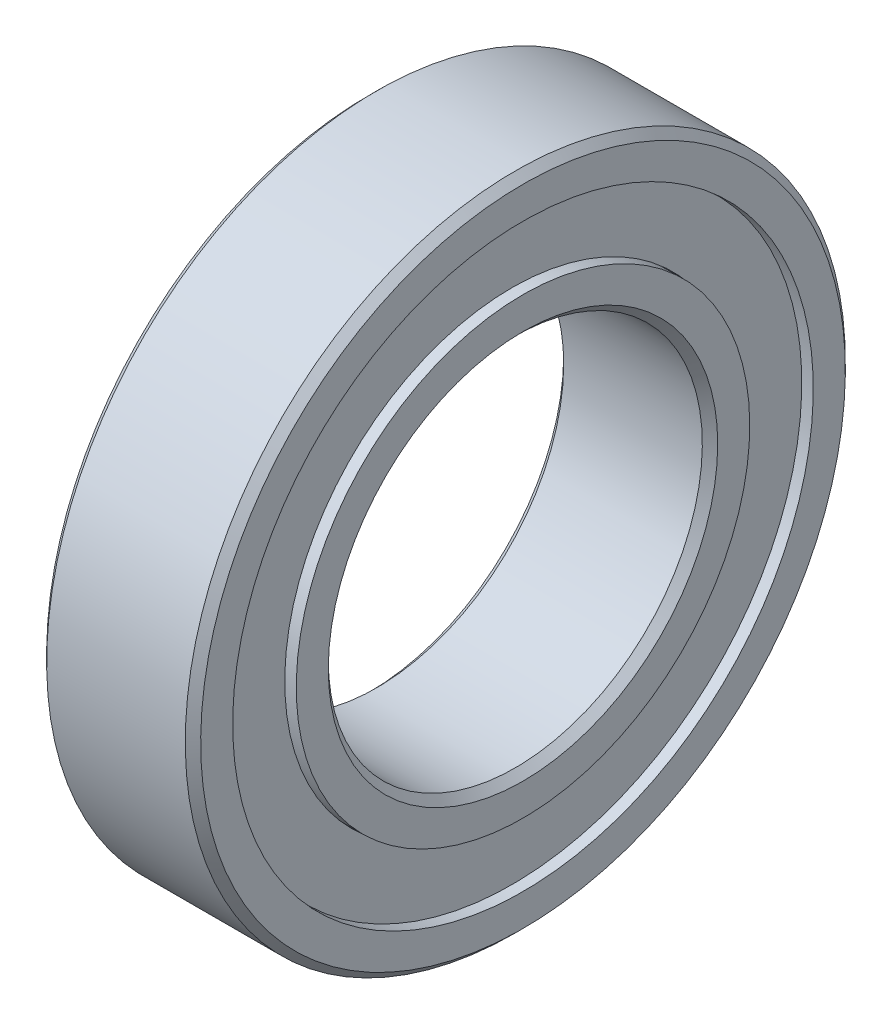
ISO-10303-21;
HEADER;
FILE_DESCRIPTION(('STEP AP214'),'2;1');
FILE_NAME('part.step','',(''),(''),'','','');
FILE_SCHEMA(('AUTOMOTIVE_DESIGN { 1 0 10303 214 1 1 1 1 }'));
ENDSEC;
DATA;
#1=APPLICATION_CONTEXT('core data for automotive mechanical design processes');
#2=APPLICATION_PROTOCOL_DEFINITION('international standard','automotive_design',2000,#1);
#3=PRODUCT_CONTEXT('',#1,'mechanical');
#4=PRODUCT('Part','Part','',(#3));
#5=PRODUCT_RELATED_PRODUCT_CATEGORY('part','',(#4));
#6=PRODUCT_DEFINITION_FORMATION('','',#4);
#7=PRODUCT_DEFINITION_CONTEXT('part definition',#1,'design');
#8=PRODUCT_DEFINITION('design','',#6,#7);
#9=PRODUCT_DEFINITION_SHAPE('','',#8);
#10=(LENGTH_UNIT() NAMED_UNIT(*) SI_UNIT(.MILLI.,.METRE.));
#11=(NAMED_UNIT(*) PLANE_ANGLE_UNIT() SI_UNIT($,.RADIAN.));
#12=(NAMED_UNIT(*) SI_UNIT($,.STERADIAN.) SOLID_ANGLE_UNIT());
#13=UNCERTAINTY_MEASURE_WITH_UNIT(LENGTH_MEASURE(1.E-05),#10,'distance_accuracy_value','');
#14=(GEOMETRIC_REPRESENTATION_CONTEXT(3) GLOBAL_UNCERTAINTY_ASSIGNED_CONTEXT((#13)) GLOBAL_UNIT_ASSIGNED_CONTEXT((#10,
#11,#12)) REPRESENTATION_CONTEXT('',''));
#15=CARTESIAN_POINT('',(0.,0.,0.));
#16=DIRECTION('',(0.,0.,1.));
#17=DIRECTION('',(1.,0.,0.));
#18=AXIS2_PLACEMENT_3D('',#15,#16,#17);
#19=CARTESIAN_POINT('',(-25.5018873985858,-2.61746866563937,9.99387314684654));
#20=DIRECTION('',(1.,0.,0.));
#21=DIRECTION('',(0.,0.253361719694149,-0.967371613700559));
#22=AXIS2_PLACEMENT_3D('',#19,#20,#21);
#23=PLANE('',#22);
#24=CARTESIAN_POINT('',(-25.5018873985858,0.,0.));
#25=DIRECTION('',(1.,0.,0.));
#26=DIRECTION('',(0.,0.253361719694149,-0.967371613700559));
#27=AXIS2_PLACEMENT_3D('',#24,#25,#26);
#28=CIRCLE('',#27,10.3309555555556);
#29=CARTESIAN_POINT('',(-25.5018873985858,2.61746866563937,-9.99387314684654));
#30=VERTEX_POINT('',#29);
#31=EDGE_CURVE('P0_E33',#30,#30,#28,.T.);
#32=ORIENTED_EDGE('',*,*,#31,.T.);
#33=EDGE_LOOP('',(#32));
#34=FACE_BOUND('',#33,.T.);
#35=CARTESIAN_POINT('',(-25.5018873985858,0.,0.));
#36=DIRECTION('',(1.,0.,0.));
#37=DIRECTION('',(0.,0.253361719694149,-0.967371613700559));
#38=AXIS2_PLACEMENT_3D('',#35,#36,#37);
#39=CIRCLE('',#38,13.1690444444444);
#40=CARTESIAN_POINT('',(-25.5018873985858,3.33653174717312,-12.7393597751166));
#41=VERTEX_POINT('',#40);
#42=EDGE_CURVE('P0_E24',#41,#41,#39,.T.);
#43=ORIENTED_EDGE('',*,*,#42,.F.);
#44=EDGE_LOOP('',(#43));
#45=FACE_BOUND('',#44,.T.);
#46=ADVANCED_FACE('P0_F15',(#34,#45),#23,.F.);
#47=CARTESIAN_POINT('',(-25.1208873985858,-2.61746866563937,9.99387314684654));
#48=DIRECTION('',(-1.,0.,0.));
#49=DIRECTION('',(0.,-0.253361719694149,0.967371613700559));
#50=AXIS2_PLACEMENT_3D('',#47,#48,#49);
#51=PLANE('',#50);
#52=CARTESIAN_POINT('',(-25.1208873985858,0.,0.));
#53=DIRECTION('',(1.,0.,0.));
#54=DIRECTION('',(0.,0.253361719694149,-0.967371613700559));
#55=AXIS2_PLACEMENT_3D('',#52,#53,#54);
#56=CIRCLE('',#55,13.1690444444444);
#57=CARTESIAN_POINT('',(-25.1208873985858,3.33653174717312,-12.7393597751166));
#58=VERTEX_POINT('',#57);
#59=EDGE_CURVE('P0_E10',#58,#58,#56,.T.);
#60=ORIENTED_EDGE('',*,*,#59,.T.);
#61=EDGE_LOOP('',(#60));
#62=FACE_BOUND('',#61,.T.);
#63=CARTESIAN_POINT('',(-25.1208873985858,0.,0.));
#64=DIRECTION('',(1.,0.,0.));
#65=DIRECTION('',(0.,0.253361719694149,-0.967371613700559));
#66=AXIS2_PLACEMENT_3D('',#63,#64,#65);
#67=CIRCLE('',#66,10.3309555555556);
#68=CARTESIAN_POINT('',(-25.1208873985858,2.61746866563937,-9.99387314684654));
#69=VERTEX_POINT('',#68);
#70=EDGE_CURVE('P0_E19',#69,#69,#67,.T.);
#71=ORIENTED_EDGE('',*,*,#70,.F.);
#72=EDGE_LOOP('',(#71));
#73=FACE_BOUND('',#72,.T.);
#74=ADVANCED_FACE('P0_F47',(#62,#73),#51,.F.);
#75=CARTESIAN_POINT('',(-19.,0.,0.));
#76=DIRECTION('',(1.,0.,0.));
#77=DIRECTION('',(0.,0.253361719694149,-0.967371613700559));
#78=AXIS2_PLACEMENT_3D('',#75,#76,#77);
#79=CYLINDRICAL_SURFACE('',#78,13.1690444444444);
#80=ORIENTED_EDGE('',*,*,#59,.F.);
#81=EDGE_LOOP('',(#80));
#82=FACE_BOUND('',#81,.T.);
#83=ORIENTED_EDGE('',*,*,#42,.T.);
#84=EDGE_LOOP('',(#83));
#85=FACE_BOUND('',#84,.T.);
#86=ADVANCED_FACE('P0_F49',(#82,#85),#79,.T.);
#87=CARTESIAN_POINT('',(-19.,0.,0.));
#88=DIRECTION('',(1.,0.,0.));
#89=DIRECTION('',(0.,0.253361719694149,-0.967371613700559));
#90=AXIS2_PLACEMENT_3D('',#87,#88,#89);
#91=CYLINDRICAL_SURFACE('',#90,10.3309555555556);
#92=ORIENTED_EDGE('',*,*,#70,.T.);
#93=EDGE_LOOP('',(#92));
#94=FACE_BOUND('',#93,.T.);
#95=ORIENTED_EDGE('',*,*,#31,.F.);
#96=EDGE_LOOP('',(#95));
#97=FACE_BOUND('',#96,.T.);
#98=ADVANCED_FACE('P0_F17',(#94,#97),#91,.F.);
#99=CLOSED_SHELL('',(#46,#74,#86,#98));
#100=MANIFOLD_SOLID_BREP('P0_B1',#99);
#101=CARTESIAN_POINT('',(-19.8791126014143,-2.61746866563937,9.99387314684654));
#102=DIRECTION('',(1.,0.,0.));
#103=DIRECTION('',(0.,0.253361719694149,-0.967371613700559));
#104=AXIS2_PLACEMENT_3D('',#101,#102,#103);
#105=PLANE('',#104);
#106=CARTESIAN_POINT('',(-19.8791126014143,0.,0.));
#107=DIRECTION('',(1.,0.,0.));
#108=DIRECTION('',(0.,0.253361719694149,-0.967371613700559));
#109=AXIS2_PLACEMENT_3D('',#106,#107,#108);
#110=CIRCLE('',#109,10.3309555555556);
#111=CARTESIAN_POINT('',(-19.8791126014143,2.61746866563937,-9.99387314684654));
#112=VERTEX_POINT('',#111);
#113=EDGE_CURVE('P1_E19',#112,#112,#110,.T.);
#114=ORIENTED_EDGE('',*,*,#113,.T.);
#115=EDGE_LOOP('',(#114));
#116=FACE_BOUND('',#115,.T.);
#117=CARTESIAN_POINT('',(-19.8791126014143,0.,0.));
#118=DIRECTION('',(1.,0.,0.));
#119=DIRECTION('',(0.,0.253361719694149,-0.967371613700559));
#120=AXIS2_PLACEMENT_3D('',#117,#118,#119);
#121=CIRCLE('',#120,13.1690444444444);
#122=CARTESIAN_POINT('',(-19.8791126014143,3.33653174717312,-12.7393597751166));
#123=VERTEX_POINT('',#122);
#124=EDGE_CURVE('P1_E35',#123,#123,#121,.T.);
#125=ORIENTED_EDGE('',*,*,#124,.F.);
#126=EDGE_LOOP('',(#125));
#127=FACE_BOUND('',#126,.T.);
#128=ADVANCED_FACE('P1_F15',(#116,#127),#105,.F.);
#129=CARTESIAN_POINT('',(-19.4981126014143,-2.61746866563937,9.99387314684654));
#130=DIRECTION('',(-1.,0.,0.));
#131=DIRECTION('',(0.,-0.253361719694149,0.967371613700559));
#132=AXIS2_PLACEMENT_3D('',#129,#130,#131);
#133=PLANE('',#132);
#134=CARTESIAN_POINT('',(-19.4981126014143,0.,0.));
#135=DIRECTION('',(1.,0.,0.));
#136=DIRECTION('',(0.,0.253361719694149,-0.967371613700559));
#137=AXIS2_PLACEMENT_3D('',#134,#135,#136);
#138=CIRCLE('',#137,13.1690444444444);
#139=CARTESIAN_POINT('',(-19.4981126014143,3.33653174717312,-12.7393597751166));
#140=VERTEX_POINT('',#139);
#141=EDGE_CURVE('P1_E31',#140,#140,#138,.T.);
#142=ORIENTED_EDGE('',*,*,#141,.T.);
#143=EDGE_LOOP('',(#142));
#144=FACE_BOUND('',#143,.T.);
#145=CARTESIAN_POINT('',(-19.4981126014143,0.,0.));
#146=DIRECTION('',(1.,0.,0.));
#147=DIRECTION('',(0.,0.253361719694149,-0.967371613700559));
#148=AXIS2_PLACEMENT_3D('',#145,#146,#147);
#149=CIRCLE('',#148,10.3309555555556);
#150=CARTESIAN_POINT('',(-19.4981126014143,2.61746866563937,-9.99387314684654));
#151=VERTEX_POINT('',#150);
#152=EDGE_CURVE('P1_E10',#151,#151,#149,.T.);
#153=ORIENTED_EDGE('',*,*,#152,.F.);
#154=EDGE_LOOP('',(#153));
#155=FACE_BOUND('',#154,.T.);
#156=ADVANCED_FACE('P1_F44',(#144,#155),#133,.F.);
#157=CARTESIAN_POINT('',(-19.,0.,0.));
#158=DIRECTION('',(1.,0.,0.));
#159=DIRECTION('',(0.,0.253361719694149,-0.967371613700559));
#160=AXIS2_PLACEMENT_3D('',#157,#158,#159);
#161=CYLINDRICAL_SURFACE('',#160,10.3309555555556);
#162=ORIENTED_EDGE('',*,*,#152,.T.);
#163=EDGE_LOOP('',(#162));
#164=FACE_BOUND('',#163,.T.);
#165=ORIENTED_EDGE('',*,*,#113,.F.);
#166=EDGE_LOOP('',(#165));
#167=FACE_BOUND('',#166,.T.);
#168=ADVANCED_FACE('P1_F50',(#164,#167),#161,.F.);
#169=CARTESIAN_POINT('',(-19.,0.,0.));
#170=DIRECTION('',(1.,0.,0.));
#171=DIRECTION('',(0.,0.253361719694149,-0.967371613700559));
#172=AXIS2_PLACEMENT_3D('',#169,#170,#171);
#173=CYLINDRICAL_SURFACE('',#172,13.1690444444444);
#174=ORIENTED_EDGE('',*,*,#141,.F.);
#175=EDGE_LOOP('',(#174));
#176=FACE_BOUND('',#175,.T.);
#177=ORIENTED_EDGE('',*,*,#124,.T.);
#178=EDGE_LOOP('',(#177));
#179=FACE_BOUND('',#178,.T.);
#180=ADVANCED_FACE('P1_F17',(#176,#179),#173,.T.);
#181=CLOSED_SHELL('',(#128,#156,#168,#180));
#182=MANIFOLD_SOLID_BREP('P1_B1',#181);
#183=CARTESIAN_POINT('',(-19.,-3.71174919351928,14.1719941407132));
#184=DIRECTION('',(-1.,0.,0.));
#185=DIRECTION('',(0.,-0.253361719694149,0.967371613700559));
#186=AXIS2_PLACEMENT_3D('',#183,#184,#185);
#187=PLANE('',#186);
#188=CARTESIAN_POINT('',(-19.,0.,0.));
#189=DIRECTION('',(1.,0.,0.));
#190=DIRECTION('',(0.,0.253361719694149,-0.967371613700559));
#191=AXIS2_PLACEMENT_3D('',#188,#189,#190);
#192=CIRCLE('',#191,14.65);
#193=CARTESIAN_POINT('',(-19.,3.71174919351928,-14.1719941407132));
#194=VERTEX_POINT('',#193);
#195=EDGE_CURVE('P2_E10',#194,#194,#192,.T.);
#196=ORIENTED_EDGE('',*,*,#195,.T.);
#197=EDGE_LOOP('',(#196));
#198=FACE_BOUND('',#197,.T.);
#199=CARTESIAN_POINT('',(-19.,0.,0.));
#200=DIRECTION('',(1.,0.,0.));
#201=DIRECTION('',(0.,0.253361719694149,-0.967371613700559));
#202=AXIS2_PLACEMENT_3D('',#199,#200,#201);
#203=CIRCLE('',#202,13.1944444444444);
#204=CARTESIAN_POINT('',(-19.,3.34296713485335,-12.7639310141046));
#205=VERTEX_POINT('',#204);
#206=EDGE_CURVE('P2_E51',#205,#205,#203,.T.);
#207=ORIENTED_EDGE('',*,*,#206,.F.);
#208=EDGE_LOOP('',(#207));
#209=FACE_BOUND('',#208,.T.);
#210=ADVANCED_FACE('P2_F15',(#198,#209),#187,.F.);
#211=CARTESIAN_POINT('',(-26.,-3.71174919351928,14.1719941407132));
#212=DIRECTION('',(1.,0.,0.));
#213=DIRECTION('',(0.,0.253361719694149,-0.967371613700559));
#214=AXIS2_PLACEMENT_3D('',#211,#212,#213);
#215=PLANE('',#214);
#216=CARTESIAN_POINT('',(-26.,0.,0.));
#217=DIRECTION('',(1.,0.,0.));
#218=DIRECTION('',(0.,0.253361719694149,-0.967371613700559));
#219=AXIS2_PLACEMENT_3D('',#216,#217,#218);
#220=CIRCLE('',#219,13.1944444444444);
#221=CARTESIAN_POINT('',(-26.,3.34296713485335,-12.7639310141046));
#222=VERTEX_POINT('',#221);
#223=EDGE_CURVE('P2_E44',#222,#222,#220,.T.);
#224=ORIENTED_EDGE('',*,*,#223,.T.);
#225=EDGE_LOOP('',(#224));
#226=FACE_BOUND('',#225,.T.);
#227=CARTESIAN_POINT('',(-26.,0.,0.));
#228=DIRECTION('',(1.,0.,0.));
#229=DIRECTION('',(0.,0.253361719694149,-0.967371613700559));
#230=AXIS2_PLACEMENT_3D('',#227,#228,#229);
#231=CIRCLE('',#230,14.65);
#232=CARTESIAN_POINT('',(-26.,3.71174919351928,-14.1719941407132));
#233=VERTEX_POINT('',#232);
#234=EDGE_CURVE('P2_E36',#233,#233,#231,.T.);
#235=ORIENTED_EDGE('',*,*,#234,.F.);
#236=EDGE_LOOP('',(#235));
#237=FACE_BOUND('',#236,.T.);
#238=ADVANCED_FACE('P2_F78',(#226,#237),#215,.F.);
#239=CARTESIAN_POINT('',(-19.35,0.,0.));
#240=DIRECTION('',(-1.,0.,0.));
#241=DIRECTION('',(0.,-0.253361719694149,0.967371613700559));
#242=AXIS2_PLACEMENT_3D('',#239,#240,#241);
#243=CONICAL_SURFACE('',#242,15.,0.785398163397452);
#244=CARTESIAN_POINT('',(-19.35,0.,0.));
#245=DIRECTION('',(1.,0.,0.));
#246=DIRECTION('',(0.,0.253361719694149,-0.967371613700559));
#247=AXIS2_PLACEMENT_3D('',#244,#245,#246);
#248=CIRCLE('',#247,15.);
#249=CARTESIAN_POINT('',(-19.35,3.80042579541223,-14.5105742055084));
#250=VERTEX_POINT('',#249);
#251=EDGE_CURVE('P2_E22',#250,#250,#248,.T.);
#252=ORIENTED_EDGE('',*,*,#251,.T.);
#253=EDGE_LOOP('',(#252));
#254=FACE_BOUND('',#253,.T.);
#255=ORIENTED_EDGE('',*,*,#195,.F.);
#256=EDGE_LOOP('',(#255));
#257=FACE_BOUND('',#256,.T.);
#258=ADVANCED_FACE('P2_F82',(#254,#257),#243,.T.);
#259=CARTESIAN_POINT('',(-19.,0.,0.));
#260=DIRECTION('',(1.,0.,0.));
#261=DIRECTION('',(0.,0.253361719694149,-0.967371613700559));
#262=AXIS2_PLACEMENT_3D('',#259,#260,#261);
#263=CYLINDRICAL_SURFACE('',#262,15.);
#264=ORIENTED_EDGE('',*,*,#251,.F.);
#265=EDGE_LOOP('',(#264));
#266=FACE_BOUND('',#265,.T.);
#267=CARTESIAN_POINT('',(-25.65,0.,0.));
#268=DIRECTION('',(1.,0.,0.));
#269=DIRECTION('',(0.,0.253361719694149,-0.967371613700559));
#270=AXIS2_PLACEMENT_3D('',#267,#268,#269);
#271=CIRCLE('',#270,15.);
#272=CARTESIAN_POINT('',(-25.65,3.80042579541223,-14.5105742055084));
#273=VERTEX_POINT('',#272);
#274=EDGE_CURVE('P2_E29',#273,#273,#271,.T.);
#275=ORIENTED_EDGE('',*,*,#274,.T.);
#276=EDGE_LOOP('',(#275));
#277=FACE_BOUND('',#276,.T.);
#278=ADVANCED_FACE('P2_F88',(#266,#277),#263,.T.);
#279=CARTESIAN_POINT('',(-26.,0.,0.));
#280=DIRECTION('',(1.,0.,0.));
#281=DIRECTION('',(0.,0.253361719694149,-0.967371613700559));
#282=AXIS2_PLACEMENT_3D('',#279,#280,#281);
#283=CONICAL_SURFACE('',#282,14.65,0.785398163397452);
#284=ORIENTED_EDGE('',*,*,#274,.F.);
#285=EDGE_LOOP('',(#284));
#286=FACE_BOUND('',#285,.T.);
#287=ORIENTED_EDGE('',*,*,#234,.T.);
#288=EDGE_LOOP('',(#287));
#289=FACE_BOUND('',#288,.T.);
#290=ADVANCED_FACE('P2_F75',(#286,#289),#283,.T.);
#291=CARTESIAN_POINT('',(-19.,0.,0.));
#292=DIRECTION('',(1.,0.,0.));
#293=DIRECTION('',(0.,0.253361719694149,-0.967371613700559));
#294=AXIS2_PLACEMENT_3D('',#291,#292,#293);
#295=CYLINDRICAL_SURFACE('',#294,13.1944444444444);
#296=CARTESIAN_POINT('',(-24.0555555555556,0.,0.));
#297=DIRECTION('',(1.,0.,0.));
#298=DIRECTION('',(0.,0.253361719694149,-0.967371613700559));
#299=AXIS2_PLACEMENT_3D('',#296,#297,#298);
#300=CIRCLE('',#299,13.1944444444444);
#301=CARTESIAN_POINT('',(-24.0555555555556,3.34296713485335,-12.7639310141046));
#302=VERTEX_POINT('',#301);
#303=EDGE_CURVE('P2_E39',#302,#302,#300,.T.);
#304=ORIENTED_EDGE('',*,*,#303,.T.);
#305=EDGE_LOOP('',(#304));
#306=FACE_BOUND('',#305,.T.);
#307=ORIENTED_EDGE('',*,*,#223,.F.);
#308=EDGE_LOOP('',(#307));
#309=FACE_BOUND('',#308,.T.);
#310=ADVANCED_FACE('P2_F62',(#306,#309),#295,.F.);
#311=CARTESIAN_POINT('',(-22.5,0.,0.));
#312=DIRECTION('',(1.,0.,0.));
#313=DIRECTION('',(0.,0.253361719694149,-0.967371613700559));
#314=AXIS2_PLACEMENT_3D('',#311,#312,#313);
#315=TOROIDAL_SURFACE('',#314,11.75,2.12277479717142);
#316=CARTESIAN_POINT('',(-20.9444444444444,0.,0.));
#317=DIRECTION('',(1.,0.,0.));
#318=DIRECTION('',(0.,0.253361719694149,-0.967371613700559));
#319=AXIS2_PLACEMENT_3D('',#316,#317,#318);
#320=CIRCLE('',#319,13.1944444444444);
#321=CARTESIAN_POINT('',(-20.9444444444444,3.34296713485335,-12.7639310141046));
#322=VERTEX_POINT('',#321);
#323=EDGE_CURVE('P2_E48',#322,#322,#320,.T.);
#324=ORIENTED_EDGE('',*,*,#323,.T.);
#325=EDGE_LOOP('',(#324));
#326=FACE_BOUND('',#325,.T.);
#327=ORIENTED_EDGE('',*,*,#303,.F.);
#328=EDGE_LOOP('',(#327));
#329=FACE_BOUND('',#328,.T.);
#330=ADVANCED_FACE('P2_F65',(#326,#329),#315,.F.);
#331=ORIENTED_EDGE('',*,*,#206,.T.);
#332=EDGE_LOOP('',(#331));
#333=FACE_BOUND('',#332,.T.);
#334=ORIENTED_EDGE('',*,*,#323,.F.);
#335=EDGE_LOOP('',(#334));
#336=FACE_BOUND('',#335,.T.);
#337=ADVANCED_FACE('P2_F67',(#333,#336),#295,.F.);
#338=CLOSED_SHELL('',(#210,#238,#258,#278,#290,#310,#330,#337));
#339=MANIFOLD_SOLID_BREP('P2_B1',#338);
#340=CARTESIAN_POINT('',(-26.,-2.24225121929321,8.56123878124995));
#341=DIRECTION('',(1.,0.,0.));
#342=DIRECTION('',(0.,0.253361719694149,-0.967371613700559));
#343=AXIS2_PLACEMENT_3D('',#340,#341,#342);
#344=PLANE('',#343);
#345=CARTESIAN_POINT('',(-26.,0.,0.));
#346=DIRECTION('',(1.,0.,0.));
#347=DIRECTION('',(0.,0.253361719694149,-0.967371613700559));
#348=AXIS2_PLACEMENT_3D('',#345,#346,#347);
#349=CIRCLE('',#348,8.85);
#350=CARTESIAN_POINT('',(-26.,2.24225121929321,-8.56123878124995));
#351=VERTEX_POINT('',#350);
#352=EDGE_CURVE('P3_E41',#351,#351,#349,.T.);
#353=ORIENTED_EDGE('',*,*,#352,.T.);
#354=EDGE_LOOP('',(#353));
#355=FACE_BOUND('',#354,.T.);
#356=CARTESIAN_POINT('',(-26.,0.,0.));
#357=DIRECTION('',(1.,0.,0.));
#358=DIRECTION('',(0.,0.253361719694149,-0.967371613700559));
#359=AXIS2_PLACEMENT_3D('',#356,#357,#358);
#360=CIRCLE('',#359,10.3055555555555);
#361=CARTESIAN_POINT('',(-26.,2.61103327795914,-9.96930190785852));
#362=VERTEX_POINT('',#361);
#363=EDGE_CURVE('P3_E32',#362,#362,#360,.T.);
#364=ORIENTED_EDGE('',*,*,#363,.F.);
#365=EDGE_LOOP('',(#364));
#366=FACE_BOUND('',#365,.T.);
#367=ADVANCED_FACE('P3_F15',(#355,#366),#344,.F.);
#368=CARTESIAN_POINT('',(-19.,-2.61103327795914,9.96930190785852));
#369=DIRECTION('',(-1.,0.,0.));
#370=DIRECTION('',(0.,-0.253361719694149,0.967371613700559));
#371=AXIS2_PLACEMENT_3D('',#368,#369,#370);
#372=PLANE('',#371);
#373=CARTESIAN_POINT('',(-19.,0.,0.));
#374=DIRECTION('',(1.,0.,0.));
#375=DIRECTION('',(0.,0.253361719694149,-0.967371613700559));
#376=AXIS2_PLACEMENT_3D('',#373,#374,#375);
#377=CIRCLE('',#376,10.3055555555555);
#378=CARTESIAN_POINT('',(-19.,2.61103327795914,-9.96930190785852));
#379=VERTEX_POINT('',#378);
#380=EDGE_CURVE('P3_E10',#379,#379,#377,.T.);
#381=ORIENTED_EDGE('',*,*,#380,.T.);
#382=EDGE_LOOP('',(#381));
#383=FACE_BOUND('',#382,.T.);
#384=CARTESIAN_POINT('',(-19.,0.,0.));
#385=DIRECTION('',(1.,0.,0.));
#386=DIRECTION('',(0.,0.253361719694149,-0.967371613700559));
#387=AXIS2_PLACEMENT_3D('',#384,#385,#386);
#388=CIRCLE('',#387,8.85);
#389=CARTESIAN_POINT('',(-19.,2.24225121929321,-8.56123878124995));
#390=VERTEX_POINT('',#389);
#391=EDGE_CURVE('P3_E35',#390,#390,#388,.T.);
#392=ORIENTED_EDGE('',*,*,#391,.F.);
#393=EDGE_LOOP('',(#392));
#394=FACE_BOUND('',#393,.T.);
#395=ADVANCED_FACE('P3_F81',(#383,#394),#372,.F.);
#396=CARTESIAN_POINT('',(-19.,0.,0.));
#397=DIRECTION('',(1.,0.,0.));
#398=DIRECTION('',(0.,0.253361719694149,-0.967371613700559));
#399=AXIS2_PLACEMENT_3D('',#396,#397,#398);
#400=CYLINDRICAL_SURFACE('',#399,10.3055555555555);
#401=ORIENTED_EDGE('',*,*,#380,.F.);
#402=EDGE_LOOP('',(#401));
#403=FACE_BOUND('',#402,.T.);
#404=CARTESIAN_POINT('',(-20.9444444444444,0.,0.));
#405=DIRECTION('',(1.,0.,0.));
#406=DIRECTION('',(0.,0.253361719694149,-0.967371613700559));
#407=AXIS2_PLACEMENT_3D('',#404,#405,#406);
#408=CIRCLE('',#407,10.3055555555555);
#409=CARTESIAN_POINT('',(-20.9444444444444,2.61103327795914,-9.96930190785852));
#410=VERTEX_POINT('',#409);
#411=EDGE_CURVE('P3_E57',#410,#410,#408,.T.);
#412=ORIENTED_EDGE('',*,*,#411,.T.);
#413=EDGE_LOOP('',(#412));
#414=FACE_BOUND('',#413,.T.);
#415=ADVANCED_FACE('P3_F67',(#403,#414),#400,.T.);
#416=CARTESIAN_POINT('',(-24.0555555555556,0.,0.));
#417=DIRECTION('',(1.,0.,0.));
#418=DIRECTION('',(0.,0.253361719694149,-0.967371613700559));
#419=AXIS2_PLACEMENT_3D('',#416,#417,#418);
#420=CIRCLE('',#419,10.3055555555555);
#421=CARTESIAN_POINT('',(-24.0555555555556,2.61103327795914,-9.96930190785852));
#422=VERTEX_POINT('',#421);
#423=EDGE_CURVE('P3_E24',#422,#422,#420,.T.);
#424=ORIENTED_EDGE('',*,*,#423,.F.);
#425=EDGE_LOOP('',(#424));
#426=FACE_BOUND('',#425,.T.);
#427=ORIENTED_EDGE('',*,*,#363,.T.);
#428=EDGE_LOOP('',(#427));
#429=FACE_BOUND('',#428,.T.);
#430=ADVANCED_FACE('P3_F91',(#426,#429),#400,.T.);
#431=CARTESIAN_POINT('',(-25.65,0.,0.));
#432=DIRECTION('',(-1.,0.,0.));
#433=DIRECTION('',(0.,-0.253361719694149,0.967371613700559));
#434=AXIS2_PLACEMENT_3D('',#431,#432,#433);
#435=CONICAL_SURFACE('',#434,8.5,0.785398163397438);
#436=ORIENTED_EDGE('',*,*,#352,.F.);
#437=EDGE_LOOP('',(#436));
#438=FACE_BOUND('',#437,.T.);
#439=CARTESIAN_POINT('',(-25.65,0.,0.));
#440=DIRECTION('',(1.,0.,0.));
#441=DIRECTION('',(0.,0.253361719694149,-0.967371613700559));
#442=AXIS2_PLACEMENT_3D('',#439,#440,#441);
#443=CIRCLE('',#442,8.5);
#444=CARTESIAN_POINT('',(-25.65,2.15357461740026,-8.22265871645475));
#445=VERTEX_POINT('',#444);
#446=EDGE_CURVE('P3_E44',#445,#445,#443,.T.);
#447=ORIENTED_EDGE('',*,*,#446,.T.);
#448=EDGE_LOOP('',(#447));
#449=FACE_BOUND('',#448,.T.);
#450=ADVANCED_FACE('P3_F89',(#438,#449),#435,.F.);
#451=CARTESIAN_POINT('',(-19.,0.,0.));
#452=DIRECTION('',(1.,0.,0.));
#453=DIRECTION('',(0.,0.253361719694149,-0.967371613700559));
#454=AXIS2_PLACEMENT_3D('',#451,#452,#453);
#455=CYLINDRICAL_SURFACE('',#454,8.5);
#456=CARTESIAN_POINT('',(-19.35,0.,0.));
#457=DIRECTION('',(1.,0.,0.));
#458=DIRECTION('',(0.,0.253361719694149,-0.967371613700559));
#459=AXIS2_PLACEMENT_3D('',#456,#457,#458);
#460=CIRCLE('',#459,8.5);
#461=CARTESIAN_POINT('',(-19.35,2.15357461740026,-8.22265871645475));
#462=VERTEX_POINT('',#461);
#463=EDGE_CURVE('P3_E19',#462,#462,#460,.T.);
#464=ORIENTED_EDGE('',*,*,#463,.T.);
#465=EDGE_LOOP('',(#464));
#466=FACE_BOUND('',#465,.T.);
#467=ORIENTED_EDGE('',*,*,#446,.F.);
#468=EDGE_LOOP('',(#467));
#469=FACE_BOUND('',#468,.T.);
#470=ADVANCED_FACE('P3_F77',(#466,#469),#455,.F.);
#471=CARTESIAN_POINT('',(-19.,0.,0.));
#472=DIRECTION('',(1.,0.,0.));
#473=DIRECTION('',(0.,0.253361719694149,-0.967371613700559));
#474=AXIS2_PLACEMENT_3D('',#471,#472,#473);
#475=CONICAL_SURFACE('',#474,8.85,0.785398163397441);
#476=ORIENTED_EDGE('',*,*,#391,.T.);
#477=EDGE_LOOP('',(#476));
#478=FACE_BOUND('',#477,.T.);
#479=ORIENTED_EDGE('',*,*,#463,.F.);
#480=EDGE_LOOP('',(#479));
#481=FACE_BOUND('',#480,.T.);
#482=ADVANCED_FACE('P3_F17',(#478,#481),#475,.F.);
#483=CARTESIAN_POINT('',(-22.5,0.,0.));
#484=DIRECTION('',(1.,0.,0.));
#485=DIRECTION('',(0.,0.253361719694149,-0.967371613700559));
#486=AXIS2_PLACEMENT_3D('',#483,#484,#485);
#487=TOROIDAL_SURFACE('',#486,11.75,2.12277479717142);
#488=ORIENTED_EDGE('',*,*,#423,.T.);
#489=EDGE_LOOP('',(#488));
#490=FACE_BOUND('',#489,.T.);
#491=ORIENTED_EDGE('',*,*,#411,.F.);
#492=EDGE_LOOP('',(#491));
#493=FACE_BOUND('',#492,.T.);
#494=ADVANCED_FACE('P3_F69',(#490,#493),#487,.F.);
#495=CLOSED_SHELL('',(#367,#395,#415,#430,#450,#470,#482,#494));
#496=MANIFOLD_SOLID_BREP('P3_B1',#495);
#497=ADVANCED_BREP_SHAPE_REPRESENTATION('',(#18,#100,#182,#339,#496),#14);
#498=SHAPE_DEFINITION_REPRESENTATION(#9,#497);
ENDSEC;
END-ISO-10303-21;
